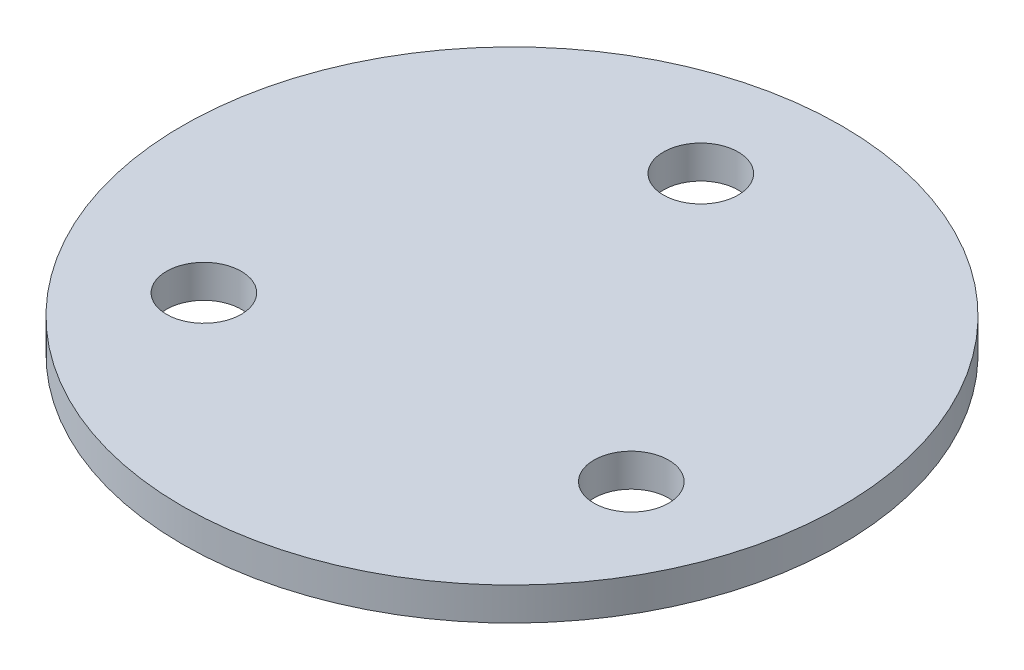
ISO-10303-21;
HEADER;
FILE_DESCRIPTION(('STEP AP214'),'2;1');
FILE_NAME('part.step','',(''),(''),'','','');
FILE_SCHEMA(('AUTOMOTIVE_DESIGN { 1 0 10303 214 1 1 1 1 }'));
ENDSEC;
DATA;
#1=APPLICATION_CONTEXT('core data for automotive mechanical design processes');
#2=APPLICATION_PROTOCOL_DEFINITION('international standard','automotive_design',2000,#1);
#3=PRODUCT_CONTEXT('',#1,'mechanical');
#4=PRODUCT('Part','Part','',(#3));
#5=PRODUCT_RELATED_PRODUCT_CATEGORY('part','',(#4));
#6=PRODUCT_DEFINITION_FORMATION('','',#4);
#7=PRODUCT_DEFINITION_CONTEXT('part definition',#1,'design');
#8=PRODUCT_DEFINITION('design','',#6,#7);
#9=PRODUCT_DEFINITION_SHAPE('','',#8);
#10=(LENGTH_UNIT() NAMED_UNIT(*) SI_UNIT(.MILLI.,.METRE.));
#11=(NAMED_UNIT(*) PLANE_ANGLE_UNIT() SI_UNIT($,.RADIAN.));
#12=(NAMED_UNIT(*) SI_UNIT($,.STERADIAN.) SOLID_ANGLE_UNIT());
#13=UNCERTAINTY_MEASURE_WITH_UNIT(LENGTH_MEASURE(1.E-05),#10,'distance_accuracy_value','');
#14=(GEOMETRIC_REPRESENTATION_CONTEXT(3) GLOBAL_UNCERTAINTY_ASSIGNED_CONTEXT((#13)) GLOBAL_UNIT_ASSIGNED_CONTEXT((#10,
#11,#12)) REPRESENTATION_CONTEXT('',''));
#15=CARTESIAN_POINT('',(0.,0.,0.));
#16=DIRECTION('',(0.,0.,1.));
#17=DIRECTION('',(1.,0.,0.));
#18=AXIS2_PLACEMENT_3D('',#15,#16,#17);
#19=CARTESIAN_POINT('',(0.,1.5,0.));
#20=DIRECTION('',(0.,1.,0.));
#21=DIRECTION('',(0.,0.,1.));
#22=AXIS2_PLACEMENT_3D('',#19,#20,#21);
#23=PLANE('',#22);
#24=CARTESIAN_POINT('',(-7.92526929440424,1.5,6.09836917635963));
#25=DIRECTION('',(0.,1.,0.));
#26=DIRECTION('',(0.,0.,1.));
#27=AXIS2_PLACEMENT_3D('',#24,#25,#26);
#28=CIRCLE('',#27,1.70000000000016);
#29=CARTESIAN_POINT('',(-7.92526929440424,1.5,7.79836917635979));
#30=VERTEX_POINT('',#29);
#31=EDGE_CURVE('E52',#30,#30,#28,.T.);
#32=ORIENTED_EDGE('',*,*,#31,.F.);
#33=EDGE_LOOP('',(#32));
#34=FACE_BOUND('',#33,.T.);
#35=CARTESIAN_POINT('',(0.,1.5,0.));
#36=DIRECTION('',(0.,1.,0.));
#37=DIRECTION('',(0.,0.,1.));
#38=AXIS2_PLACEMENT_3D('',#35,#36,#37);
#39=CIRCLE('',#38,15.);
#40=CARTESIAN_POINT('',(0.,1.5,15.));
#41=VERTEX_POINT('',#40);
#42=EDGE_CURVE('E10',#41,#41,#39,.T.);
#43=ORIENTED_EDGE('',*,*,#42,.T.);
#44=EDGE_LOOP('',(#43));
#45=FACE_BOUND('',#44,.T.);
#46=CARTESIAN_POINT('',(9.24397727558554,1.5,3.81429995260703));
#47=DIRECTION('',(0.,1.,0.));
#48=DIRECTION('',(0.,0.,1.));
#49=AXIS2_PLACEMENT_3D('',#46,#47,#48);
#50=CIRCLE('',#49,1.70000000000001);
#51=CARTESIAN_POINT('',(9.24397727558554,1.5,5.51429995260704));
#52=VERTEX_POINT('',#51);
#53=EDGE_CURVE('E48',#52,#52,#50,.T.);
#54=ORIENTED_EDGE('',*,*,#53,.F.);
#55=EDGE_LOOP('',(#54));
#56=FACE_BOUND('',#55,.T.);
#57=CARTESIAN_POINT('',(-1.31870798118131,1.5,-9.91266912896664));
#58=DIRECTION('',(0.,1.,0.));
#59=DIRECTION('',(0.,0.,1.));
#60=AXIS2_PLACEMENT_3D('',#57,#58,#59);
#61=CIRCLE('',#60,1.70000000000007);
#62=CARTESIAN_POINT('',(-1.31870798118131,1.5,-8.21266912896657));
#63=VERTEX_POINT('',#62);
#64=EDGE_CURVE('E56',#63,#63,#61,.T.);
#65=ORIENTED_EDGE('',*,*,#64,.F.);
#66=EDGE_LOOP('',(#65));
#67=FACE_BOUND('',#66,.T.);
#68=ADVANCED_FACE('F40',(#34,#45,#56,#67),#23,.T.);
#69=CARTESIAN_POINT('',(0.,0.,0.));
#70=DIRECTION('',(0.,1.,0.));
#71=DIRECTION('',(0.,0.,1.));
#72=AXIS2_PLACEMENT_3D('',#69,#70,#71);
#73=PLANE('',#72);
#74=CARTESIAN_POINT('',(0.,0.,0.));
#75=DIRECTION('',(0.,1.,0.));
#76=DIRECTION('',(0.,0.,1.));
#77=AXIS2_PLACEMENT_3D('',#74,#75,#76);
#78=CIRCLE('',#77,15.);
#79=CARTESIAN_POINT('',(0.,0.,15.));
#80=VERTEX_POINT('',#79);
#81=EDGE_CURVE('E41',#80,#80,#78,.T.);
#82=ORIENTED_EDGE('',*,*,#81,.F.);
#83=EDGE_LOOP('',(#82));
#84=FACE_BOUND('',#83,.T.);
#85=CARTESIAN_POINT('',(9.24397727558554,0.,3.81429995260703));
#86=DIRECTION('',(0.,1.,0.));
#87=DIRECTION('',(0.,0.,1.));
#88=AXIS2_PLACEMENT_3D('',#85,#86,#87);
#89=CIRCLE('',#88,1.70000000000001);
#90=CARTESIAN_POINT('',(9.24397727558554,0.,5.51429995260704));
#91=VERTEX_POINT('',#90);
#92=EDGE_CURVE('E49',#91,#91,#89,.T.);
#93=ORIENTED_EDGE('',*,*,#92,.T.);
#94=EDGE_LOOP('',(#93));
#95=FACE_BOUND('',#94,.T.);
#96=CARTESIAN_POINT('',(-7.92526929440424,0.,6.09836917635963));
#97=DIRECTION('',(0.,1.,0.));
#98=DIRECTION('',(0.,0.,1.));
#99=AXIS2_PLACEMENT_3D('',#96,#97,#98);
#100=CIRCLE('',#99,1.70000000000016);
#101=CARTESIAN_POINT('',(-7.92526929440424,0.,7.79836917635979));
#102=VERTEX_POINT('',#101);
#103=EDGE_CURVE('E57',#102,#102,#100,.T.);
#104=ORIENTED_EDGE('',*,*,#103,.T.);
#105=EDGE_LOOP('',(#104));
#106=FACE_BOUND('',#105,.T.);
#107=CARTESIAN_POINT('',(-1.31870798118131,0.,-9.91266912896664));
#108=DIRECTION('',(0.,1.,0.));
#109=DIRECTION('',(0.,0.,1.));
#110=AXIS2_PLACEMENT_3D('',#107,#108,#109);
#111=CIRCLE('',#110,1.70000000000007);
#112=CARTESIAN_POINT('',(-1.31870798118131,0.,-8.21266912896657));
#113=VERTEX_POINT('',#112);
#114=EDGE_CURVE('E62',#113,#113,#111,.T.);
#115=ORIENTED_EDGE('',*,*,#114,.T.);
#116=EDGE_LOOP('',(#115));
#117=FACE_BOUND('',#116,.T.);
#118=ADVANCED_FACE('F72',(#84,#95,#106,#117),#73,.F.);
#119=CARTESIAN_POINT('',(0.,1.5,0.));
#120=DIRECTION('',(0.,-1.,0.));
#121=DIRECTION('',(0.,0.,-1.));
#122=AXIS2_PLACEMENT_3D('',#119,#120,#121);
#123=CYLINDRICAL_SURFACE('',#122,15.);
#124=ORIENTED_EDGE('',*,*,#42,.F.);
#125=EDGE_LOOP('',(#124));
#126=FACE_BOUND('',#125,.T.);
#127=ORIENTED_EDGE('',*,*,#81,.T.);
#128=EDGE_LOOP('',(#127));
#129=FACE_BOUND('',#128,.T.);
#130=ADVANCED_FACE('F39',(#126,#129),#123,.T.);
#131=CARTESIAN_POINT('',(9.24397727558554,1.5,3.81429995260703));
#132=DIRECTION('',(0.,-1.,0.));
#133=DIRECTION('',(0.,0.,-1.));
#134=AXIS2_PLACEMENT_3D('',#131,#132,#133);
#135=CYLINDRICAL_SURFACE('',#134,1.70000000000001);
#136=ORIENTED_EDGE('',*,*,#53,.T.);
#137=EDGE_LOOP('',(#136));
#138=FACE_BOUND('',#137,.T.);
#139=ORIENTED_EDGE('',*,*,#92,.F.);
#140=EDGE_LOOP('',(#139));
#141=FACE_BOUND('',#140,.T.);
#142=ADVANCED_FACE('F83',(#138,#141),#135,.F.);
#143=CARTESIAN_POINT('',(-7.92526929440424,1.5,6.09836917635963));
#144=DIRECTION('',(0.,-1.,0.));
#145=DIRECTION('',(0.,0.,-1.));
#146=AXIS2_PLACEMENT_3D('',#143,#144,#145);
#147=CYLINDRICAL_SURFACE('',#146,1.70000000000016);
#148=ORIENTED_EDGE('',*,*,#31,.T.);
#149=EDGE_LOOP('',(#148));
#150=FACE_BOUND('',#149,.T.);
#151=ORIENTED_EDGE('',*,*,#103,.F.);
#152=EDGE_LOOP('',(#151));
#153=FACE_BOUND('',#152,.T.);
#154=ADVANCED_FACE('F84',(#150,#153),#147,.F.);
#155=CARTESIAN_POINT('',(-1.31870798118131,1.5,-9.91266912896664));
#156=DIRECTION('',(0.,-1.,0.));
#157=DIRECTION('',(0.,0.,-1.));
#158=AXIS2_PLACEMENT_3D('',#155,#156,#157);
#159=CYLINDRICAL_SURFACE('',#158,1.70000000000007);
#160=ORIENTED_EDGE('',*,*,#64,.T.);
#161=EDGE_LOOP('',(#160));
#162=FACE_BOUND('',#161,.T.);
#163=ORIENTED_EDGE('',*,*,#114,.F.);
#164=EDGE_LOOP('',(#163));
#165=FACE_BOUND('',#164,.T.);
#166=ADVANCED_FACE('F66',(#162,#165),#159,.F.);
#167=CLOSED_SHELL('',(#68,#118,#130,#142,#154,#166));
#168=MANIFOLD_SOLID_BREP('B2',#167);
#169=ADVANCED_BREP_SHAPE_REPRESENTATION('',(#18,#168),#14);
#170=SHAPE_DEFINITION_REPRESENTATION(#9,#169);
ENDSEC;
END-ISO-10303-21;
